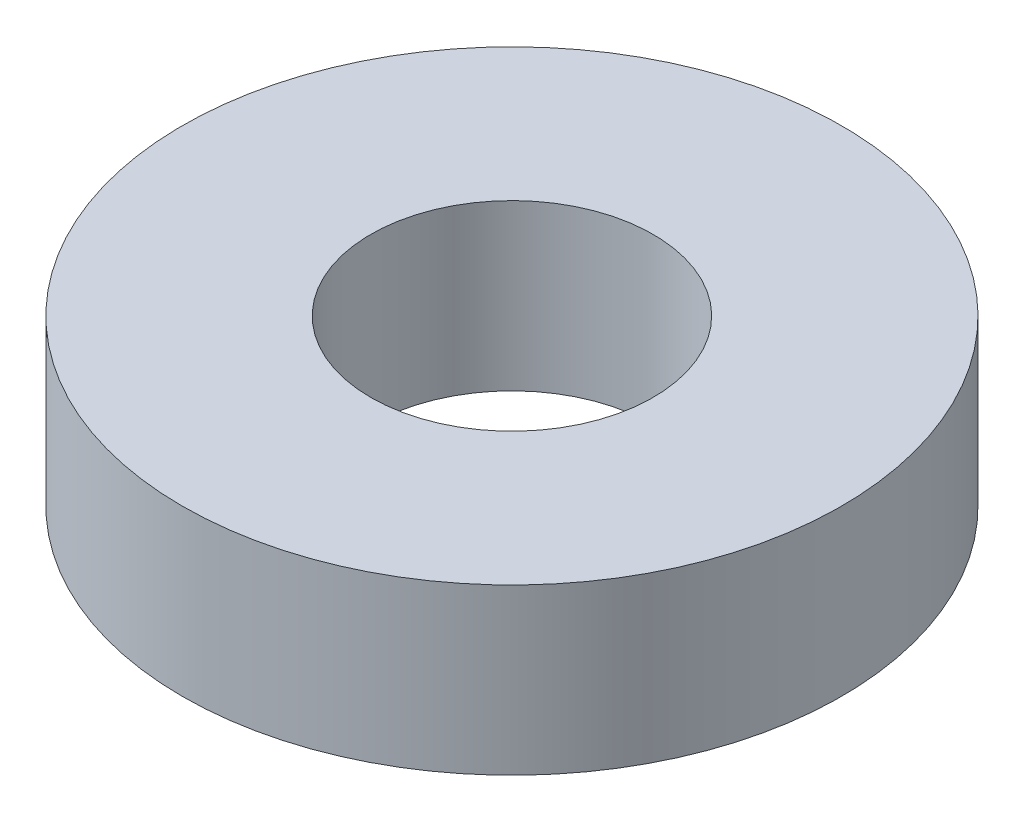
ISO-10303-21;
HEADER;
FILE_DESCRIPTION(('STEP AP214'),'2;1');
FILE_NAME('part.step','',(''),(''),'','','');
FILE_SCHEMA(('AUTOMOTIVE_DESIGN { 1 0 10303 214 1 1 1 1 }'));
ENDSEC;
DATA;
#1=APPLICATION_CONTEXT('core data for automotive mechanical design processes');
#2=APPLICATION_PROTOCOL_DEFINITION('international standard','automotive_design',2000,#1);
#3=PRODUCT_CONTEXT('',#1,'mechanical');
#4=PRODUCT('Part','Part','',(#3));
#5=PRODUCT_RELATED_PRODUCT_CATEGORY('part','',(#4));
#6=PRODUCT_DEFINITION_FORMATION('','',#4);
#7=PRODUCT_DEFINITION_CONTEXT('part definition',#1,'design');
#8=PRODUCT_DEFINITION('design','',#6,#7);
#9=PRODUCT_DEFINITION_SHAPE('','',#8);
#10=(LENGTH_UNIT() NAMED_UNIT(*) SI_UNIT(.MILLI.,.METRE.));
#11=(NAMED_UNIT(*) PLANE_ANGLE_UNIT() SI_UNIT($,.RADIAN.));
#12=(NAMED_UNIT(*) SI_UNIT($,.STERADIAN.) SOLID_ANGLE_UNIT());
#13=UNCERTAINTY_MEASURE_WITH_UNIT(LENGTH_MEASURE(1.E-05),#10,'distance_accuracy_value','');
#14=(GEOMETRIC_REPRESENTATION_CONTEXT(3) GLOBAL_UNCERTAINTY_ASSIGNED_CONTEXT((#13)) GLOBAL_UNIT_ASSIGNED_CONTEXT((#10,
#11,#12)) REPRESENTATION_CONTEXT('',''));
#15=CARTESIAN_POINT('',(0.,0.,0.));
#16=DIRECTION('',(0.,0.,1.));
#17=DIRECTION('',(1.,0.,0.));
#18=AXIS2_PLACEMENT_3D('',#15,#16,#17);
#19=CARTESIAN_POINT('',(0.,7.,0.));
#20=DIRECTION('',(0.,1.,0.));
#21=DIRECTION('',(0.,0.,1.));
#22=AXIS2_PLACEMENT_3D('',#19,#20,#21);
#23=PLANE('',#22);
#24=CARTESIAN_POINT('',(0.,7.,0.));
#25=DIRECTION('',(0.,1.,0.));
#26=DIRECTION('',(0.,0.,1.));
#27=AXIS2_PLACEMENT_3D('',#24,#25,#26);
#28=CIRCLE('',#27,14.);
#29=CARTESIAN_POINT('',(0.,7.,14.));
#30=VERTEX_POINT('',#29);
#31=EDGE_CURVE('E10',#30,#30,#28,.T.);
#32=ORIENTED_EDGE('',*,*,#31,.T.);
#33=EDGE_LOOP('',(#32));
#34=FACE_BOUND('',#33,.T.);
#35=CARTESIAN_POINT('',(0.,7.,0.));
#36=DIRECTION('',(0.,1.,0.));
#37=DIRECTION('',(0.,0.,1.));
#38=AXIS2_PLACEMENT_3D('',#35,#36,#37);
#39=CIRCLE('',#38,6.);
#40=CARTESIAN_POINT('',(0.,7.,6.));
#41=VERTEX_POINT('',#40);
#42=EDGE_CURVE('E42',#41,#41,#39,.T.);
#43=ORIENTED_EDGE('',*,*,#42,.F.);
#44=EDGE_LOOP('',(#43));
#45=FACE_BOUND('',#44,.T.);
#46=ADVANCED_FACE('F31',(#34,#45),#23,.T.);
#47=CARTESIAN_POINT('',(0.,0.,0.));
#48=DIRECTION('',(0.,1.,0.));
#49=DIRECTION('',(0.,0.,1.));
#50=AXIS2_PLACEMENT_3D('',#47,#48,#49);
#51=PLANE('',#50);
#52=CARTESIAN_POINT('',(0.,0.,0.));
#53=DIRECTION('',(0.,1.,0.));
#54=DIRECTION('',(0.,0.,1.));
#55=AXIS2_PLACEMENT_3D('',#52,#53,#54);
#56=CIRCLE('',#55,14.);
#57=CARTESIAN_POINT('',(0.,0.,14.));
#58=VERTEX_POINT('',#57);
#59=EDGE_CURVE('E35',#58,#58,#56,.T.);
#60=ORIENTED_EDGE('',*,*,#59,.F.);
#61=EDGE_LOOP('',(#60));
#62=FACE_BOUND('',#61,.T.);
#63=CARTESIAN_POINT('',(0.,0.,0.));
#64=DIRECTION('',(0.,1.,0.));
#65=DIRECTION('',(0.,0.,1.));
#66=AXIS2_PLACEMENT_3D('',#63,#64,#65);
#67=CIRCLE('',#66,6.);
#68=CARTESIAN_POINT('',(0.,0.,6.));
#69=VERTEX_POINT('',#68);
#70=EDGE_CURVE('E44',#69,#69,#67,.T.);
#71=ORIENTED_EDGE('',*,*,#70,.T.);
#72=EDGE_LOOP('',(#71));
#73=FACE_BOUND('',#72,.T.);
#74=ADVANCED_FACE('F54',(#62,#73),#51,.F.);
#75=CARTESIAN_POINT('',(0.,7.,0.));
#76=DIRECTION('',(0.,-1.,0.));
#77=DIRECTION('',(0.,0.,-1.));
#78=AXIS2_PLACEMENT_3D('',#75,#76,#77);
#79=CYLINDRICAL_SURFACE('',#78,14.);
#80=ORIENTED_EDGE('',*,*,#31,.F.);
#81=EDGE_LOOP('',(#80));
#82=FACE_BOUND('',#81,.T.);
#83=ORIENTED_EDGE('',*,*,#59,.T.);
#84=EDGE_LOOP('',(#83));
#85=FACE_BOUND('',#84,.T.);
#86=ADVANCED_FACE('F33',(#82,#85),#79,.T.);
#87=CARTESIAN_POINT('',(0.,7.,0.));
#88=DIRECTION('',(0.,-1.,0.));
#89=DIRECTION('',(0.,0.,-1.));
#90=AXIS2_PLACEMENT_3D('',#87,#88,#89);
#91=CYLINDRICAL_SURFACE('',#90,6.);
#92=ORIENTED_EDGE('',*,*,#42,.T.);
#93=EDGE_LOOP('',(#92));
#94=FACE_BOUND('',#93,.T.);
#95=ORIENTED_EDGE('',*,*,#70,.F.);
#96=EDGE_LOOP('',(#95));
#97=FACE_BOUND('',#96,.T.);
#98=ADVANCED_FACE('F50',(#94,#97),#91,.F.);
#99=CLOSED_SHELL('',(#46,#74,#86,#98));
#100=MANIFOLD_SOLID_BREP('B2',#99);
#101=ADVANCED_BREP_SHAPE_REPRESENTATION('',(#18,#100),#14);
#102=SHAPE_DEFINITION_REPRESENTATION(#9,#101);
ENDSEC;
END-ISO-10303-21;
